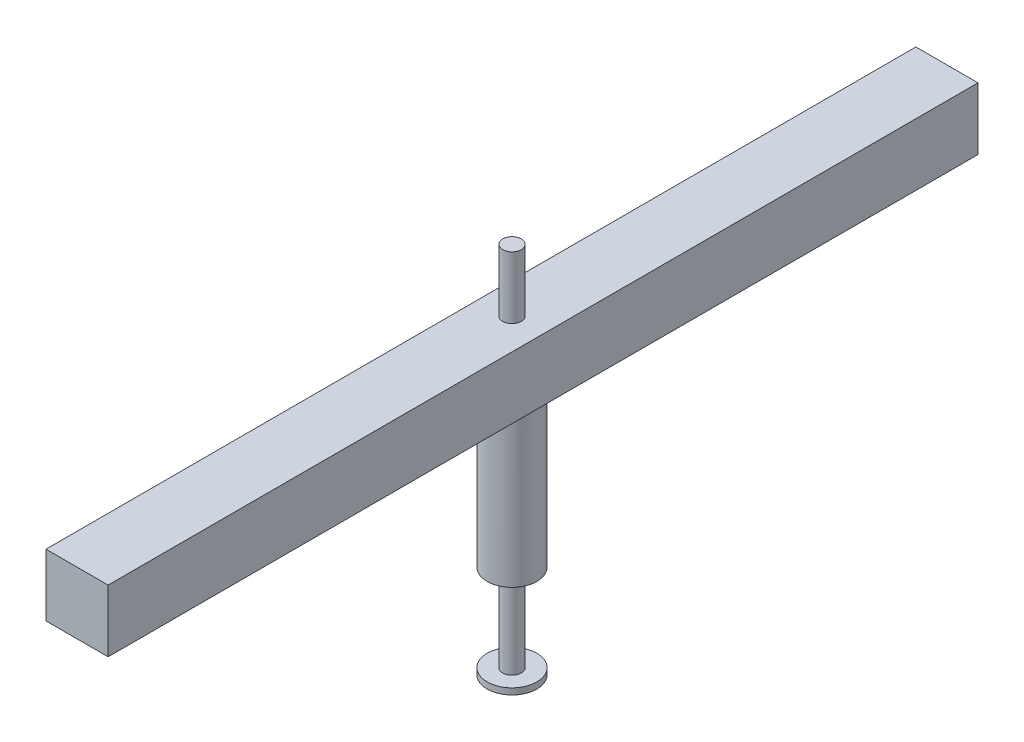
ISO-10303-21;
HEADER;
FILE_DESCRIPTION(('STEP AP214'),'2;1');
FILE_NAME('part.step','',(''),(''),'','','');
FILE_SCHEMA(('AUTOMOTIVE_DESIGN { 1 0 10303 214 1 1 1 1 }'));
ENDSEC;
DATA;
#1=APPLICATION_CONTEXT('core data for automotive mechanical design processes');
#2=APPLICATION_PROTOCOL_DEFINITION('international standard','automotive_design',2000,#1);
#3=PRODUCT_CONTEXT('',#1,'mechanical');
#4=PRODUCT('Part','Part','',(#3));
#5=PRODUCT_RELATED_PRODUCT_CATEGORY('part','',(#4));
#6=PRODUCT_DEFINITION_FORMATION('','',#4);
#7=PRODUCT_DEFINITION_CONTEXT('part definition',#1,'design');
#8=PRODUCT_DEFINITION('design','',#6,#7);
#9=PRODUCT_DEFINITION_SHAPE('','',#8);
#10=(LENGTH_UNIT() NAMED_UNIT(*) SI_UNIT(.MILLI.,.METRE.));
#11=(NAMED_UNIT(*) PLANE_ANGLE_UNIT() SI_UNIT($,.RADIAN.));
#12=(NAMED_UNIT(*) SI_UNIT($,.STERADIAN.) SOLID_ANGLE_UNIT());
#13=UNCERTAINTY_MEASURE_WITH_UNIT(LENGTH_MEASURE(1.E-05),#10,'distance_accuracy_value','');
#14=(GEOMETRIC_REPRESENTATION_CONTEXT(3) GLOBAL_UNCERTAINTY_ASSIGNED_CONTEXT((#13)) GLOBAL_UNIT_ASSIGNED_CONTEXT((#10,
#11,#12)) REPRESENTATION_CONTEXT('',''));
#15=CARTESIAN_POINT('',(0.,0.,0.));
#16=DIRECTION('',(0.,0.,1.));
#17=DIRECTION('',(1.,0.,0.));
#18=AXIS2_PLACEMENT_3D('',#15,#16,#17);
#19=CARTESIAN_POINT('',(-50.,-50.,1400.));
#20=DIRECTION('',(1.,0.,0.));
#21=DIRECTION('',(0.,0.,-1.));
#22=AXIS2_PLACEMENT_3D('',#19,#20,#21);
#23=PLANE('',#22);
#24=DIRECTION('',(0.,-1.,0.));
#25=VECTOR('',#24,1.);
#26=CARTESIAN_POINT('',(-50.,-50.,0.));
#27=LINE('',#26,#25);
#28=CARTESIAN_POINT('',(-50.,50.,0.));
#29=VERTEX_POINT('',#28);
#30=CARTESIAN_POINT('',(-50.,-50.,0.));
#31=VERTEX_POINT('',#30);
#32=EDGE_CURVE('E111',#29,#31,#27,.T.);
#33=ORIENTED_EDGE('',*,*,#32,.T.);
#34=DIRECTION('',(0.,0.,-1.));
#35=VECTOR('',#34,1.);
#36=CARTESIAN_POINT('',(-50.,-50.,1400.));
#37=LINE('',#36,#35);
#38=CARTESIAN_POINT('',(-50.,-50.,1400.));
#39=VERTEX_POINT('',#38);
#40=EDGE_CURVE('E100',#39,#31,#37,.T.);
#41=ORIENTED_EDGE('',*,*,#40,.F.);
#42=DIRECTION('',(0.,-1.,0.));
#43=VECTOR('',#42,1.);
#44=CARTESIAN_POINT('',(-50.,-50.,1400.));
#45=LINE('',#44,#43);
#46=CARTESIAN_POINT('',(-50.,50.,1400.));
#47=VERTEX_POINT('',#46);
#48=EDGE_CURVE('E92',#47,#39,#45,.T.);
#49=ORIENTED_EDGE('',*,*,#48,.F.);
#50=DIRECTION('',(0.,0.,-1.));
#51=VECTOR('',#50,1.);
#52=CARTESIAN_POINT('',(-50.,50.,1400.));
#53=LINE('',#52,#51);
#54=EDGE_CURVE('E107',#47,#29,#53,.T.);
#55=ORIENTED_EDGE('',*,*,#54,.T.);
#56=EDGE_LOOP('',(#33,#41,#49,#55));
#57=FACE_BOUND('',#56,.T.);
#58=ADVANCED_FACE('F39',(#57),#23,.F.);
#59=CARTESIAN_POINT('',(50.,-50.,1400.));
#60=DIRECTION('',(0.,1.,0.));
#61=DIRECTION('',(-1.,0.,0.));
#62=AXIS2_PLACEMENT_3D('',#59,#60,#61);
#63=PLANE('',#62);
#64=CARTESIAN_POINT('',(0.,-50.,700.));
#65=DIRECTION('',(0.,1.,0.));
#66=DIRECTION('',(-1.,0.,0.));
#67=AXIS2_PLACEMENT_3D('',#64,#65,#66);
#68=CIRCLE('',#67,40.);
#69=CARTESIAN_POINT('',(-40.,-50.,700.));
#70=VERTEX_POINT('',#69);
#71=EDGE_CURVE('E48',#70,#70,#68,.F.);
#72=ORIENTED_EDGE('',*,*,#71,.F.);
#73=EDGE_LOOP('',(#72));
#74=FACE_BOUND('',#73,.T.);
#75=DIRECTION('',(1.,0.,0.));
#76=VECTOR('',#75,1.);
#77=CARTESIAN_POINT('',(50.,-50.,0.));
#78=LINE('',#77,#76);
#79=CARTESIAN_POINT('',(50.,-50.,0.));
#80=VERTEX_POINT('',#79);
#81=EDGE_CURVE('E98',#31,#80,#78,.T.);
#82=ORIENTED_EDGE('',*,*,#81,.T.);
#83=DIRECTION('',(0.,0.,-1.));
#84=VECTOR('',#83,1.);
#85=CARTESIAN_POINT('',(50.,-50.,1400.));
#86=LINE('',#85,#84);
#87=CARTESIAN_POINT('',(50.,-50.,1400.));
#88=VERTEX_POINT('',#87);
#89=EDGE_CURVE('E96',#88,#80,#86,.T.);
#90=ORIENTED_EDGE('',*,*,#89,.F.);
#91=DIRECTION('',(1.,0.,0.));
#92=VECTOR('',#91,1.);
#93=CARTESIAN_POINT('',(50.,-50.,1400.));
#94=LINE('',#93,#92);
#95=EDGE_CURVE('E87',#39,#88,#94,.T.);
#96=ORIENTED_EDGE('',*,*,#95,.F.);
#97=ORIENTED_EDGE('',*,*,#40,.T.);
#98=EDGE_LOOP('',(#82,#90,#96,#97));
#99=FACE_BOUND('',#98,.T.);
#100=ADVANCED_FACE('F97',(#74,#99),#63,.F.);
#101=CARTESIAN_POINT('',(50.,-50.,1400.));
#102=DIRECTION('',(-1.,0.,0.));
#103=DIRECTION('',(0.,0.,1.));
#104=AXIS2_PLACEMENT_3D('',#101,#102,#103);
#105=PLANE('',#104);
#106=DIRECTION('',(0.,1.,0.));
#107=VECTOR('',#106,1.);
#108=CARTESIAN_POINT('',(50.,-50.,0.));
#109=LINE('',#108,#107);
#110=CARTESIAN_POINT('',(50.,50.,0.));
#111=VERTEX_POINT('',#110);
#112=EDGE_CURVE('E73',#80,#111,#109,.T.);
#113=ORIENTED_EDGE('',*,*,#112,.T.);
#114=DIRECTION('',(0.,0.,-1.));
#115=VECTOR('',#114,1.);
#116=CARTESIAN_POINT('',(50.,50.,1400.));
#117=LINE('',#116,#115);
#118=CARTESIAN_POINT('',(50.,50.,1400.));
#119=VERTEX_POINT('',#118);
#120=EDGE_CURVE('E101',#119,#111,#117,.T.);
#121=ORIENTED_EDGE('',*,*,#120,.F.);
#122=DIRECTION('',(0.,1.,0.));
#123=VECTOR('',#122,1.);
#124=CARTESIAN_POINT('',(50.,-50.,1400.));
#125=LINE('',#124,#123);
#126=EDGE_CURVE('E90',#88,#119,#125,.T.);
#127=ORIENTED_EDGE('',*,*,#126,.F.);
#128=ORIENTED_EDGE('',*,*,#89,.T.);
#129=EDGE_LOOP('',(#113,#121,#127,#128));
#130=FACE_BOUND('',#129,.T.);
#131=ADVANCED_FACE('F103',(#130),#105,.F.);
#132=CARTESIAN_POINT('',(50.,50.,1400.));
#133=DIRECTION('',(0.,-1.,0.));
#134=DIRECTION('',(1.,0.,0.));
#135=AXIS2_PLACEMENT_3D('',#132,#133,#134);
#136=PLANE('',#135);
#137=CARTESIAN_POINT('',(0.,50.,700.));
#138=DIRECTION('',(0.,-1.,0.));
#139=DIRECTION('',(1.,0.,0.));
#140=AXIS2_PLACEMENT_3D('',#137,#138,#139);
#141=CIRCLE('',#140,15.);
#142=CARTESIAN_POINT('',(15.,50.,700.));
#143=VERTEX_POINT('',#142);
#144=EDGE_CURVE('E115',#143,#143,#141,.T.);
#145=ORIENTED_EDGE('',*,*,#144,.T.);
#146=EDGE_LOOP('',(#145));
#147=FACE_BOUND('',#146,.T.);
#148=DIRECTION('',(-1.,0.,0.));
#149=VECTOR('',#148,1.);
#150=CARTESIAN_POINT('',(50.,50.,0.));
#151=LINE('',#150,#149);
#152=EDGE_CURVE('E79',#111,#29,#151,.T.);
#153=ORIENTED_EDGE('',*,*,#152,.T.);
#154=ORIENTED_EDGE('',*,*,#54,.F.);
#155=DIRECTION('',(-1.,0.,0.));
#156=VECTOR('',#155,1.);
#157=CARTESIAN_POINT('',(50.,50.,1400.));
#158=LINE('',#157,#156);
#159=EDGE_CURVE('E56',#119,#47,#158,.T.);
#160=ORIENTED_EDGE('',*,*,#159,.F.);
#161=ORIENTED_EDGE('',*,*,#120,.T.);
#162=EDGE_LOOP('',(#153,#154,#160,#161));
#163=FACE_BOUND('',#162,.T.);
#164=ADVANCED_FACE('F147',(#147,#163),#136,.F.);
#165=CARTESIAN_POINT('',(0.,0.,1400.));
#166=DIRECTION('',(0.,0.,1.));
#167=DIRECTION('',(1.,0.,0.));
#168=AXIS2_PLACEMENT_3D('',#165,#166,#167);
#169=PLANE('',#168);
#170=ORIENTED_EDGE('',*,*,#48,.T.);
#171=ORIENTED_EDGE('',*,*,#95,.T.);
#172=ORIENTED_EDGE('',*,*,#126,.T.);
#173=ORIENTED_EDGE('',*,*,#159,.T.);
#174=EDGE_LOOP('',(#170,#171,#172,#173));
#175=FACE_BOUND('',#174,.T.);
#176=ADVANCED_FACE('F88',(#175),#169,.T.);
#177=CARTESIAN_POINT('',(0.,0.,0.));
#178=DIRECTION('',(0.,0.,1.));
#179=DIRECTION('',(1.,0.,0.));
#180=AXIS2_PLACEMENT_3D('',#177,#178,#179);
#181=PLANE('',#180);
#182=ORIENTED_EDGE('',*,*,#32,.F.);
#183=ORIENTED_EDGE('',*,*,#152,.F.);
#184=ORIENTED_EDGE('',*,*,#112,.F.);
#185=ORIENTED_EDGE('',*,*,#81,.F.);
#186=EDGE_LOOP('',(#182,#183,#184,#185));
#187=FACE_BOUND('',#186,.T.);
#188=ADVANCED_FACE('F154',(#187),#181,.F.);
#189=CARTESIAN_POINT('',(0.,150.,700.));
#190=DIRECTION('',(0.,-1.,0.));
#191=DIRECTION('',(1.,0.,0.));
#192=AXIS2_PLACEMENT_3D('',#189,#190,#191);
#193=PLANE('',#192);
#194=CARTESIAN_POINT('',(0.,150.,700.));
#195=DIRECTION('',(0.,-1.,0.));
#196=DIRECTION('',(1.,0.,0.));
#197=AXIS2_PLACEMENT_3D('',#194,#195,#196);
#198=CIRCLE('',#197,15.);
#199=CARTESIAN_POINT('',(15.,150.,700.));
#200=VERTEX_POINT('',#199);
#201=EDGE_CURVE('E131',#200,#200,#198,.T.);
#202=ORIENTED_EDGE('',*,*,#201,.F.);
#203=EDGE_LOOP('',(#202));
#204=FACE_BOUND('',#203,.T.);
#205=ADVANCED_FACE('F157',(#204),#193,.F.);
#206=CARTESIAN_POINT('',(0.,150.,700.));
#207=DIRECTION('',(0.,-1.,0.));
#208=DIRECTION('',(1.,0.,0.));
#209=AXIS2_PLACEMENT_3D('',#206,#207,#208);
#210=CYLINDRICAL_SURFACE('',#209,15.);
#211=ORIENTED_EDGE('',*,*,#201,.T.);
#212=EDGE_LOOP('',(#211));
#213=FACE_BOUND('',#212,.T.);
#214=ORIENTED_EDGE('',*,*,#144,.F.);
#215=EDGE_LOOP('',(#214));
#216=FACE_BOUND('',#215,.T.);
#217=ADVANCED_FACE('F166',(#213,#216),#210,.T.);
#218=CARTESIAN_POINT('',(0.,-300.,700.));
#219=DIRECTION('',(0.,1.,0.));
#220=DIRECTION('',(-1.,0.,0.));
#221=AXIS2_PLACEMENT_3D('',#218,#219,#220);
#222=CYLINDRICAL_SURFACE('',#221,40.);
#223=CARTESIAN_POINT('',(0.,-300.,700.));
#224=DIRECTION('',(0.,-1.,0.));
#225=DIRECTION('',(1.,0.,0.));
#226=AXIS2_PLACEMENT_3D('',#223,#224,#225);
#227=CIRCLE('',#226,40.);
#228=CARTESIAN_POINT('',(40.0000000000001,-300.,700.));
#229=VERTEX_POINT('',#228);
#230=EDGE_CURVE('E193',#229,#229,#227,.T.);
#231=ORIENTED_EDGE('',*,*,#230,.F.);
#232=EDGE_LOOP('',(#231));
#233=FACE_BOUND('',#232,.T.);
#234=ORIENTED_EDGE('',*,*,#71,.T.);
#235=EDGE_LOOP('',(#234));
#236=FACE_BOUND('',#235,.T.);
#237=ADVANCED_FACE('F140',(#233,#236),#222,.T.);
#238=CARTESIAN_POINT('',(0.,-300.,700.));
#239=DIRECTION('',(0.,-1.,0.));
#240=DIRECTION('',(1.,0.,0.));
#241=AXIS2_PLACEMENT_3D('',#238,#239,#240);
#242=PLANE('',#241);
#243=CARTESIAN_POINT('',(0.,-300.,700.));
#244=DIRECTION('',(0.,-1.,0.));
#245=DIRECTION('',(1.,0.,0.));
#246=AXIS2_PLACEMENT_3D('',#243,#244,#245);
#247=CIRCLE('',#246,15.);
#248=CARTESIAN_POINT('',(15.,-300.,700.));
#249=VERTEX_POINT('',#248);
#250=EDGE_CURVE('E11',#249,#249,#247,.F.);
#251=ORIENTED_EDGE('',*,*,#250,.T.);
#252=EDGE_LOOP('',(#251));
#253=FACE_BOUND('',#252,.T.);
#254=ORIENTED_EDGE('',*,*,#230,.T.);
#255=EDGE_LOOP('',(#254));
#256=FACE_BOUND('',#255,.T.);
#257=ADVANCED_FACE('F174',(#253,#256),#242,.T.);
#258=CARTESIAN_POINT('',(0.,-450.,700.));
#259=DIRECTION('',(0.,-1.,0.));
#260=DIRECTION('',(1.,0.,0.));
#261=AXIS2_PLACEMENT_3D('',#258,#259,#260);
#262=PLANE('',#261);
#263=CARTESIAN_POINT('',(0.,-450.,700.));
#264=DIRECTION('',(0.,-1.,0.));
#265=DIRECTION('',(1.,0.,0.));
#266=AXIS2_PLACEMENT_3D('',#263,#264,#265);
#267=CIRCLE('',#266,40.);
#268=CARTESIAN_POINT('',(40.0000000000001,-450.,700.));
#269=VERTEX_POINT('',#268);
#270=EDGE_CURVE('E195',#269,#269,#267,.T.);
#271=ORIENTED_EDGE('',*,*,#270,.T.);
#272=EDGE_LOOP('',(#271));
#273=FACE_BOUND('',#272,.T.);
#274=ADVANCED_FACE('F170',(#273),#262,.T.);
#275=CARTESIAN_POINT('',(0.,-440.,700.));
#276=DIRECTION('',(0.,-1.,0.));
#277=DIRECTION('',(1.,0.,0.));
#278=AXIS2_PLACEMENT_3D('',#275,#276,#277);
#279=CYLINDRICAL_SURFACE('',#278,40.);
#280=CARTESIAN_POINT('',(0.,-440.,700.));
#281=DIRECTION('',(0.,-1.,0.));
#282=DIRECTION('',(1.,0.,0.));
#283=AXIS2_PLACEMENT_3D('',#280,#281,#282);
#284=CIRCLE('',#283,40.);
#285=CARTESIAN_POINT('',(40.0000000000001,-440.,700.));
#286=VERTEX_POINT('',#285);
#287=EDGE_CURVE('E135',#286,#286,#284,.T.);
#288=ORIENTED_EDGE('',*,*,#287,.T.);
#289=EDGE_LOOP('',(#288));
#290=FACE_BOUND('',#289,.T.);
#291=ORIENTED_EDGE('',*,*,#270,.F.);
#292=EDGE_LOOP('',(#291));
#293=FACE_BOUND('',#292,.T.);
#294=ADVANCED_FACE('F173',(#290,#293),#279,.T.);
#295=CARTESIAN_POINT('',(0.,-440.,700.));
#296=DIRECTION('',(0.,-1.,0.));
#297=DIRECTION('',(1.,0.,0.));
#298=AXIS2_PLACEMENT_3D('',#295,#296,#297);
#299=PLANE('',#298);
#300=CARTESIAN_POINT('',(0.,-440.,700.));
#301=DIRECTION('',(0.,-1.,0.));
#302=DIRECTION('',(1.,0.,0.));
#303=AXIS2_PLACEMENT_3D('',#300,#301,#302);
#304=CIRCLE('',#303,15.);
#305=CARTESIAN_POINT('',(15.0000000000001,-440.,700.));
#306=VERTEX_POINT('',#305);
#307=EDGE_CURVE('E132',#306,#306,#304,.F.);
#308=ORIENTED_EDGE('',*,*,#307,.F.);
#309=EDGE_LOOP('',(#308));
#310=FACE_BOUND('',#309,.T.);
#311=ORIENTED_EDGE('',*,*,#287,.F.);
#312=EDGE_LOOP('',(#311));
#313=FACE_BOUND('',#312,.T.);
#314=ADVANCED_FACE('F164',(#310,#313),#299,.F.);
#315=ORIENTED_EDGE('',*,*,#250,.F.);
#316=EDGE_LOOP('',(#315));
#317=FACE_BOUND('',#316,.T.);
#318=ORIENTED_EDGE('',*,*,#307,.T.);
#319=EDGE_LOOP('',(#318));
#320=FACE_BOUND('',#319,.T.);
#321=ADVANCED_FACE('F161',(#317,#320),#210,.T.);
#322=CLOSED_SHELL('',(#58,#100,#131,#164,#176,#188,#205,#217,#237,#257,#274,#294,#314,#321));
#323=MANIFOLD_SOLID_BREP('B2',#322);
#324=ADVANCED_BREP_SHAPE_REPRESENTATION('',(#18,#323),#14);
#325=SHAPE_DEFINITION_REPRESENTATION(#9,#324);
ENDSEC;
END-ISO-10303-21;
